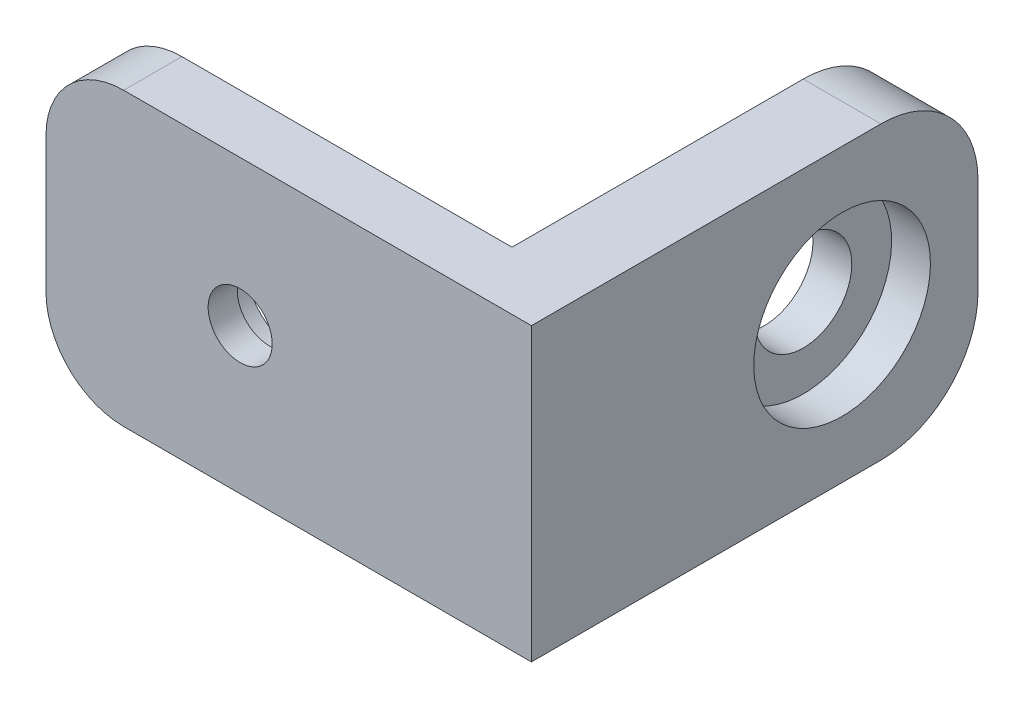
ISO-10303-21;
HEADER;
FILE_DESCRIPTION(('STEP AP214'),'2;1');
FILE_NAME('part.step','',(''),(''),'','','');
FILE_SCHEMA(('AUTOMOTIVE_DESIGN { 1 0 10303 214 1 1 1 1 }'));
ENDSEC;
DATA;
#1=APPLICATION_CONTEXT('core data for automotive mechanical design processes');
#2=APPLICATION_PROTOCOL_DEFINITION('international standard','automotive_design',2000,#1);
#3=PRODUCT_CONTEXT('',#1,'mechanical');
#4=PRODUCT('Part','Part','',(#3));
#5=PRODUCT_RELATED_PRODUCT_CATEGORY('part','',(#4));
#6=PRODUCT_DEFINITION_FORMATION('','',#4);
#7=PRODUCT_DEFINITION_CONTEXT('part definition',#1,'design');
#8=PRODUCT_DEFINITION('design','',#6,#7);
#9=PRODUCT_DEFINITION_SHAPE('','',#8);
#10=(LENGTH_UNIT() NAMED_UNIT(*) SI_UNIT(.MILLI.,.METRE.));
#11=(NAMED_UNIT(*) PLANE_ANGLE_UNIT() SI_UNIT($,.RADIAN.));
#12=(NAMED_UNIT(*) SI_UNIT($,.STERADIAN.) SOLID_ANGLE_UNIT());
#13=UNCERTAINTY_MEASURE_WITH_UNIT(LENGTH_MEASURE(1.E-05),#10,'distance_accuracy_value','');
#14=(GEOMETRIC_REPRESENTATION_CONTEXT(3) GLOBAL_UNCERTAINTY_ASSIGNED_CONTEXT((#13)) GLOBAL_UNIT_ASSIGNED_CONTEXT((#10,
#11,#12)) REPRESENTATION_CONTEXT('',''));
#15=CARTESIAN_POINT('',(0.,0.,0.));
#16=DIRECTION('',(0.,0.,1.));
#17=DIRECTION('',(1.,0.,0.));
#18=AXIS2_PLACEMENT_3D('',#15,#16,#17);
#19=CARTESIAN_POINT('',(0.,-7.5,3.));
#20=DIRECTION('',(0.,-1.,0.));
#21=DIRECTION('',(0.,0.,-1.));
#22=AXIS2_PLACEMENT_3D('',#19,#20,#21);
#23=PLANE('',#22);
#24=DIRECTION('',(-1.,0.,0.));
#25=VECTOR('',#24,1.);
#26=CARTESIAN_POINT('',(0.,-7.5,3.));
#27=LINE('',#26,#25);
#28=CARTESIAN_POINT('',(12.5,-7.5,3.));
#29=VERTEX_POINT('',#28);
#30=CARTESIAN_POINT('',(-8.5,-7.5,3.));
#31=VERTEX_POINT('',#30);
#32=EDGE_CURVE('E231',#29,#31,#27,.T.);
#33=ORIENTED_EDGE('',*,*,#32,.T.);
#34=DIRECTION('',(0.,0.,-1.));
#35=VECTOR('',#34,1.);
#36=CARTESIAN_POINT('',(-8.5,-7.5,0.));
#37=LINE('',#36,#35);
#38=CARTESIAN_POINT('',(-8.5,-7.5,0.));
#39=VERTEX_POINT('',#38);
#40=EDGE_CURVE('E10',#31,#39,#37,.T.);
#41=ORIENTED_EDGE('',*,*,#40,.T.);
#42=DIRECTION('',(-1.,0.,0.));
#43=VECTOR('',#42,1.);
#44=CARTESIAN_POINT('',(0.,-7.5,0.));
#45=LINE('',#44,#43);
#46=CARTESIAN_POINT('',(8.5,-7.5,0.));
#47=VERTEX_POINT('',#46);
#48=EDGE_CURVE('E157',#47,#39,#45,.T.);
#49=ORIENTED_EDGE('',*,*,#48,.F.);
#50=DIRECTION('',(0.,0.,1.));
#51=VECTOR('',#50,1.);
#52=CARTESIAN_POINT('',(8.5,-7.5,-20.));
#53=LINE('',#52,#51);
#54=CARTESIAN_POINT('',(8.5,-7.5,-15.));
#55=VERTEX_POINT('',#54);
#56=EDGE_CURVE('E133',#55,#47,#53,.T.);
#57=ORIENTED_EDGE('',*,*,#56,.F.);
#58=DIRECTION('',(-1.,0.,0.));
#59=VECTOR('',#58,1.);
#60=CARTESIAN_POINT('',(12.5,-7.5,-15.));
#61=LINE('',#60,#59);
#62=CARTESIAN_POINT('',(12.5,-7.5,-15.));
#63=VERTEX_POINT('',#62);
#64=EDGE_CURVE('E193',#55,#63,#61,.F.);
#65=ORIENTED_EDGE('',*,*,#64,.T.);
#66=DIRECTION('',(0.,0.,-1.));
#67=VECTOR('',#66,1.);
#68=CARTESIAN_POINT('',(12.5,-7.5,3.));
#69=LINE('',#68,#67);
#70=EDGE_CURVE('E165',#29,#63,#69,.T.);
#71=ORIENTED_EDGE('',*,*,#70,.F.);
#72=EDGE_LOOP('',(#33,#41,#49,#57,#65,#71));
#73=FACE_BOUND('',#72,.T.);
#74=ADVANCED_FACE('F16',(#73),#23,.T.);
#75=CARTESIAN_POINT('',(12.5,0.,3.));
#76=DIRECTION('',(1.,0.,0.));
#77=DIRECTION('',(0.,0.,-1.));
#78=AXIS2_PLACEMENT_3D('',#75,#76,#77);
#79=PLANE('',#78);
#80=CARTESIAN_POINT('',(12.5,0.,-13.));
#81=DIRECTION('',(1.,0.,0.));
#82=DIRECTION('',(0.,1.,0.));
#83=AXIS2_PLACEMENT_3D('',#80,#81,#82);
#84=CIRCLE('',#83,4.55);
#85=CARTESIAN_POINT('',(12.5,4.55,-13.));
#86=VERTEX_POINT('',#85);
#87=EDGE_CURVE('E294',#86,#86,#84,.T.);
#88=ORIENTED_EDGE('',*,*,#87,.F.);
#89=EDGE_LOOP('',(#88));
#90=FACE_BOUND('',#89,.T.);
#91=DIRECTION('',(0.,-1.,0.));
#92=VECTOR('',#91,1.);
#93=CARTESIAN_POINT('',(12.5,0.,-20.));
#94=LINE('',#93,#92);
#95=CARTESIAN_POINT('',(12.5,2.5,-20.));
#96=VERTEX_POINT('',#95);
#97=CARTESIAN_POINT('',(12.5,-2.5,-20.));
#98=VERTEX_POINT('',#97);
#99=EDGE_CURVE('E143',#96,#98,#94,.T.);
#100=ORIENTED_EDGE('',*,*,#99,.F.);
#101=CARTESIAN_POINT('',(12.5,2.5,-15.));
#102=DIRECTION('',(1.,0.,0.));
#103=DIRECTION('',(0.,0.,-1.));
#104=AXIS2_PLACEMENT_3D('',#101,#102,#103);
#105=CIRCLE('',#104,5.);
#106=CARTESIAN_POINT('',(12.5,7.5,-15.));
#107=VERTEX_POINT('',#106);
#108=EDGE_CURVE('E190',#96,#107,#105,.T.);
#109=ORIENTED_EDGE('',*,*,#108,.T.);
#110=DIRECTION('',(0.,0.,-1.));
#111=VECTOR('',#110,1.);
#112=CARTESIAN_POINT('',(12.5,7.5,3.));
#113=LINE('',#112,#111);
#114=CARTESIAN_POINT('',(12.5,7.5,3.));
#115=VERTEX_POINT('',#114);
#116=EDGE_CURVE('E169',#115,#107,#113,.T.);
#117=ORIENTED_EDGE('',*,*,#116,.F.);
#118=DIRECTION('',(0.,-1.,0.));
#119=VECTOR('',#118,1.);
#120=CARTESIAN_POINT('',(12.5,0.,3.));
#121=LINE('',#120,#119);
#122=EDGE_CURVE('E160',#115,#29,#121,.T.);
#123=ORIENTED_EDGE('',*,*,#122,.T.);
#124=ORIENTED_EDGE('',*,*,#70,.T.);
#125=CARTESIAN_POINT('',(12.5,-2.5,-15.));
#126=DIRECTION('',(1.,0.,0.));
#127=DIRECTION('',(0.,0.,-1.));
#128=AXIS2_PLACEMENT_3D('',#125,#126,#127);
#129=CIRCLE('',#128,5.);
#130=EDGE_CURVE('E187',#63,#98,#129,.T.);
#131=ORIENTED_EDGE('',*,*,#130,.T.);
#132=EDGE_LOOP('',(#100,#109,#117,#123,#124,#131));
#133=FACE_BOUND('',#132,.T.);
#134=ADVANCED_FACE('F248',(#90,#133),#79,.T.);
#135=CARTESIAN_POINT('',(-1.78280607962806,7.5,3.));
#136=DIRECTION('',(0.,-1.,0.));
#137=DIRECTION('',(0.,0.,-1.));
#138=AXIS2_PLACEMENT_3D('',#135,#136,#137);
#139=PLANE('',#138);
#140=DIRECTION('',(-1.,0.,0.));
#141=VECTOR('',#140,1.);
#142=CARTESIAN_POINT('',(-1.78280607962806,7.5,0.));
#143=LINE('',#142,#141);
#144=CARTESIAN_POINT('',(8.5,7.5,0.));
#145=VERTEX_POINT('',#144);
#146=CARTESIAN_POINT('',(-8.5,7.5,0.));
#147=VERTEX_POINT('',#146);
#148=EDGE_CURVE('E127',#145,#147,#143,.T.);
#149=ORIENTED_EDGE('',*,*,#148,.T.);
#150=DIRECTION('',(0.,0.,-1.));
#151=VECTOR('',#150,1.);
#152=CARTESIAN_POINT('',(-8.5,7.5,3.));
#153=LINE('',#152,#151);
#154=CARTESIAN_POINT('',(-8.5,7.5,3.));
#155=VERTEX_POINT('',#154);
#156=EDGE_CURVE('E50',#147,#155,#153,.F.);
#157=ORIENTED_EDGE('',*,*,#156,.T.);
#158=DIRECTION('',(-1.,0.,0.));
#159=VECTOR('',#158,1.);
#160=CARTESIAN_POINT('',(-1.78280607962806,7.5,3.));
#161=LINE('',#160,#159);
#162=EDGE_CURVE('E164',#115,#155,#161,.T.);
#163=ORIENTED_EDGE('',*,*,#162,.F.);
#164=ORIENTED_EDGE('',*,*,#116,.T.);
#165=DIRECTION('',(-1.,0.,0.));
#166=VECTOR('',#165,1.);
#167=CARTESIAN_POINT('',(-1.78280607962806,7.5,-15.));
#168=LINE('',#167,#166);
#169=CARTESIAN_POINT('',(8.5,7.5,-15.));
#170=VERTEX_POINT('',#169);
#171=EDGE_CURVE('E130',#107,#170,#168,.T.);
#172=ORIENTED_EDGE('',*,*,#171,.T.);
#173=DIRECTION('',(0.,0.,1.));
#174=VECTOR('',#173,1.);
#175=CARTESIAN_POINT('',(8.5,7.5,-20.));
#176=LINE('',#175,#174);
#177=EDGE_CURVE('E123',#170,#145,#176,.T.);
#178=ORIENTED_EDGE('',*,*,#177,.T.);
#179=EDGE_LOOP('',(#149,#157,#163,#164,#172,#178));
#180=FACE_BOUND('',#179,.T.);
#181=ADVANCED_FACE('F125',(#180),#139,.F.);
#182=CARTESIAN_POINT('',(-12.5,0.,3.));
#183=DIRECTION('',(1.,0.,0.));
#184=DIRECTION('',(0.,1.,0.));
#185=AXIS2_PLACEMENT_3D('',#182,#183,#184);
#186=PLANE('',#185);
#187=DIRECTION('',(0.,-1.,0.));
#188=VECTOR('',#187,1.);
#189=CARTESIAN_POINT('',(-12.5,0.,3.));
#190=LINE('',#189,#188);
#191=CARTESIAN_POINT('',(-12.5,3.5,3.));
#192=VERTEX_POINT('',#191);
#193=CARTESIAN_POINT('',(-12.5,-3.5,3.));
#194=VERTEX_POINT('',#193);
#195=EDGE_CURVE('E223',#192,#194,#190,.T.);
#196=ORIENTED_EDGE('',*,*,#195,.F.);
#197=DIRECTION('',(0.,0.,-1.));
#198=VECTOR('',#197,1.);
#199=CARTESIAN_POINT('',(-12.5,3.5,3.));
#200=LINE('',#199,#198);
#201=CARTESIAN_POINT('',(-12.5,3.5,0.));
#202=VERTEX_POINT('',#201);
#203=EDGE_CURVE('E205',#192,#202,#200,.T.);
#204=ORIENTED_EDGE('',*,*,#203,.T.);
#205=DIRECTION('',(0.,-1.,0.));
#206=VECTOR('',#205,1.);
#207=CARTESIAN_POINT('',(-12.5,0.,0.));
#208=LINE('',#207,#206);
#209=CARTESIAN_POINT('',(-12.5,-3.5,0.));
#210=VERTEX_POINT('',#209);
#211=EDGE_CURVE('E150',#202,#210,#208,.T.);
#212=ORIENTED_EDGE('',*,*,#211,.T.);
#213=DIRECTION('',(0.,0.,-1.));
#214=VECTOR('',#213,1.);
#215=CARTESIAN_POINT('',(-12.5,-3.5,3.));
#216=LINE('',#215,#214);
#217=EDGE_CURVE('E196',#210,#194,#216,.F.);
#218=ORIENTED_EDGE('',*,*,#217,.T.);
#219=EDGE_LOOP('',(#196,#204,#212,#218));
#220=FACE_BOUND('',#219,.T.);
#221=ADVANCED_FACE('F228',(#220),#186,.F.);
#222=CARTESIAN_POINT('',(0.,0.,3.));
#223=DIRECTION('',(0.,0.,1.));
#224=DIRECTION('',(1.,0.,0.));
#225=AXIS2_PLACEMENT_3D('',#222,#223,#224);
#226=PLANE('',#225);
#227=CARTESIAN_POINT('',(-2.5,0.,3.));
#228=DIRECTION('',(0.,0.,1.));
#229=DIRECTION('',(1.,0.,0.));
#230=AXIS2_PLACEMENT_3D('',#227,#228,#229);
#231=CIRCLE('',#230,1.65);
#232=CARTESIAN_POINT('',(-0.85,0.,3.));
#233=VERTEX_POINT('',#232);
#234=EDGE_CURVE('E20',#233,#233,#231,.T.);
#235=ORIENTED_EDGE('',*,*,#234,.F.);
#236=EDGE_LOOP('',(#235));
#237=FACE_BOUND('',#236,.T.);
#238=ORIENTED_EDGE('',*,*,#162,.T.);
#239=CARTESIAN_POINT('',(-8.5,3.5,3.));
#240=DIRECTION('',(0.,0.,1.));
#241=DIRECTION('',(1.,0.,0.));
#242=AXIS2_PLACEMENT_3D('',#239,#240,#241);
#243=CIRCLE('',#242,4.);
#244=EDGE_CURVE('E26',#155,#192,#243,.T.);
#245=ORIENTED_EDGE('',*,*,#244,.T.);
#246=ORIENTED_EDGE('',*,*,#195,.T.);
#247=CARTESIAN_POINT('',(-8.5,-3.5,3.));
#248=DIRECTION('',(0.,0.,1.));
#249=DIRECTION('',(1.,0.,0.));
#250=AXIS2_PLACEMENT_3D('',#247,#248,#249);
#251=CIRCLE('',#250,4.);
#252=EDGE_CURVE('E38',#194,#31,#251,.T.);
#253=ORIENTED_EDGE('',*,*,#252,.T.);
#254=ORIENTED_EDGE('',*,*,#32,.F.);
#255=ORIENTED_EDGE('',*,*,#122,.F.);
#256=EDGE_LOOP('',(#238,#245,#246,#253,#254,#255));
#257=FACE_BOUND('',#256,.T.);
#258=ADVANCED_FACE('F222',(#237,#257),#226,.T.);
#259=CARTESIAN_POINT('',(0.,0.,0.));
#260=DIRECTION('',(0.,0.,1.));
#261=DIRECTION('',(1.,0.,0.));
#262=AXIS2_PLACEMENT_3D('',#259,#260,#261);
#263=PLANE('',#262);
#264=CARTESIAN_POINT('',(-2.5,0.,0.));
#265=DIRECTION('',(0.,0.,-1.));
#266=DIRECTION('',(1.,0.,0.));
#267=AXIS2_PLACEMENT_3D('',#264,#265,#266);
#268=CIRCLE('',#267,2.75);
#269=CARTESIAN_POINT('',(0.25,0.,0.));
#270=VERTEX_POINT('',#269);
#271=EDGE_CURVE('E350',#270,#270,#268,.T.);
#272=ORIENTED_EDGE('',*,*,#271,.F.);
#273=EDGE_LOOP('',(#272));
#274=FACE_BOUND('',#273,.T.);
#275=ORIENTED_EDGE('',*,*,#211,.F.);
#276=CARTESIAN_POINT('',(-8.5,3.5,0.));
#277=DIRECTION('',(0.,0.,1.));
#278=DIRECTION('',(1.,0.,0.));
#279=AXIS2_PLACEMENT_3D('',#276,#277,#278);
#280=CIRCLE('',#279,4.);
#281=EDGE_CURVE('E148',#202,#147,#280,.F.);
#282=ORIENTED_EDGE('',*,*,#281,.T.);
#283=ORIENTED_EDGE('',*,*,#148,.F.);
#284=DIRECTION('',(0.,-1.,0.));
#285=VECTOR('',#284,1.);
#286=CARTESIAN_POINT('',(8.5,0.,0.));
#287=LINE('',#286,#285);
#288=EDGE_CURVE('E136',#145,#47,#287,.T.);
#289=ORIENTED_EDGE('',*,*,#288,.T.);
#290=ORIENTED_EDGE('',*,*,#48,.T.);
#291=CARTESIAN_POINT('',(-8.5,-3.5,0.));
#292=DIRECTION('',(0.,0.,1.));
#293=DIRECTION('',(1.,0.,0.));
#294=AXIS2_PLACEMENT_3D('',#291,#292,#293);
#295=CIRCLE('',#294,4.);
#296=EDGE_CURVE('E209',#39,#210,#295,.F.);
#297=ORIENTED_EDGE('',*,*,#296,.T.);
#298=EDGE_LOOP('',(#275,#282,#283,#289,#290,#297));
#299=FACE_BOUND('',#298,.T.);
#300=ADVANCED_FACE('F147',(#274,#299),#263,.F.);
#301=CARTESIAN_POINT('',(8.5,0.,-20.));
#302=DIRECTION('',(-1.,0.,0.));
#303=DIRECTION('',(0.,-1.,0.));
#304=AXIS2_PLACEMENT_3D('',#301,#302,#303);
#305=PLANE('',#304);
#306=CARTESIAN_POINT('',(8.5,0.,-13.));
#307=DIRECTION('',(-1.,0.,0.));
#308=DIRECTION('',(0.,-1.,0.));
#309=AXIS2_PLACEMENT_3D('',#306,#307,#308);
#310=CIRCLE('',#309,2.5);
#311=CARTESIAN_POINT('',(8.5,-2.5,-13.));
#312=VERTEX_POINT('',#311);
#313=EDGE_CURVE('E197',#312,#312,#310,.T.);
#314=ORIENTED_EDGE('',*,*,#313,.F.);
#315=EDGE_LOOP('',(#314));
#316=FACE_BOUND('',#315,.T.);
#317=ORIENTED_EDGE('',*,*,#177,.F.);
#318=CARTESIAN_POINT('',(8.5,2.5,-15.));
#319=DIRECTION('',(-1.,0.,0.));
#320=DIRECTION('',(0.,-1.,0.));
#321=AXIS2_PLACEMENT_3D('',#318,#319,#320);
#322=CIRCLE('',#321,5.);
#323=CARTESIAN_POINT('',(8.5,2.5,-20.));
#324=VERTEX_POINT('',#323);
#325=EDGE_CURVE('E177',#170,#324,#322,.T.);
#326=ORIENTED_EDGE('',*,*,#325,.T.);
#327=DIRECTION('',(0.,-1.,0.));
#328=VECTOR('',#327,1.);
#329=CARTESIAN_POINT('',(8.5,0.,-20.));
#330=LINE('',#329,#328);
#331=CARTESIAN_POINT('',(8.5,-2.5,-20.));
#332=VERTEX_POINT('',#331);
#333=EDGE_CURVE('E288',#324,#332,#330,.T.);
#334=ORIENTED_EDGE('',*,*,#333,.T.);
#335=CARTESIAN_POINT('',(8.5,-2.5,-15.));
#336=DIRECTION('',(-1.,0.,0.));
#337=DIRECTION('',(0.,-1.,0.));
#338=AXIS2_PLACEMENT_3D('',#335,#336,#337);
#339=CIRCLE('',#338,5.);
#340=EDGE_CURVE('E174',#332,#55,#339,.T.);
#341=ORIENTED_EDGE('',*,*,#340,.T.);
#342=ORIENTED_EDGE('',*,*,#56,.T.);
#343=ORIENTED_EDGE('',*,*,#288,.F.);
#344=EDGE_LOOP('',(#317,#326,#334,#341,#342,#343));
#345=FACE_BOUND('',#344,.T.);
#346=ADVANCED_FACE('F137',(#316,#345),#305,.T.);
#347=CARTESIAN_POINT('',(0.,0.,-20.));
#348=DIRECTION('',(0.,0.,1.));
#349=DIRECTION('',(1.,0.,0.));
#350=AXIS2_PLACEMENT_3D('',#347,#348,#349);
#351=PLANE('',#350);
#352=ORIENTED_EDGE('',*,*,#333,.F.);
#353=DIRECTION('',(-1.,0.,0.));
#354=VECTOR('',#353,1.);
#355=CARTESIAN_POINT('',(0.,2.5,-20.));
#356=LINE('',#355,#354);
#357=EDGE_CURVE('E184',#324,#96,#356,.F.);
#358=ORIENTED_EDGE('',*,*,#357,.T.);
#359=ORIENTED_EDGE('',*,*,#99,.T.);
#360=DIRECTION('',(-1.,0.,0.));
#361=VECTOR('',#360,1.);
#362=CARTESIAN_POINT('',(8.5,-2.5,-20.));
#363=LINE('',#362,#361);
#364=EDGE_CURVE('E180',#98,#332,#363,.T.);
#365=ORIENTED_EDGE('',*,*,#364,.T.);
#366=EDGE_LOOP('',(#352,#358,#359,#365));
#367=FACE_BOUND('',#366,.T.);
#368=ADVANCED_FACE('F265',(#367),#351,.F.);
#369=CARTESIAN_POINT('',(-1.78280607962806,2.5,-15.));
#370=DIRECTION('',(-1.,0.,0.));
#371=DIRECTION('',(0.,0.,1.));
#372=AXIS2_PLACEMENT_3D('',#369,#370,#371);
#373=CYLINDRICAL_SURFACE('',#372,5.);
#374=ORIENTED_EDGE('',*,*,#108,.F.);
#375=ORIENTED_EDGE('',*,*,#357,.F.);
#376=ORIENTED_EDGE('',*,*,#325,.F.);
#377=ORIENTED_EDGE('',*,*,#171,.F.);
#378=EDGE_LOOP('',(#374,#375,#376,#377));
#379=FACE_BOUND('',#378,.T.);
#380=ADVANCED_FACE('F262',(#379),#373,.T.);
#381=CARTESIAN_POINT('',(0.,-2.5,-15.));
#382=DIRECTION('',(1.,0.,0.));
#383=DIRECTION('',(0.,0.,-1.));
#384=AXIS2_PLACEMENT_3D('',#381,#382,#383);
#385=CYLINDRICAL_SURFACE('',#384,5.);
#386=ORIENTED_EDGE('',*,*,#130,.F.);
#387=ORIENTED_EDGE('',*,*,#64,.F.);
#388=ORIENTED_EDGE('',*,*,#340,.F.);
#389=ORIENTED_EDGE('',*,*,#364,.F.);
#390=EDGE_LOOP('',(#386,#387,#388,#389));
#391=FACE_BOUND('',#390,.T.);
#392=ADVANCED_FACE('F264',(#391),#385,.T.);
#393=CARTESIAN_POINT('',(10.5,0.,-13.));
#394=DIRECTION('',(1.,0.,0.));
#395=DIRECTION('',(0.,0.,-1.));
#396=AXIS2_PLACEMENT_3D('',#393,#394,#395);
#397=CYLINDRICAL_SURFACE('',#396,4.55);
#398=CARTESIAN_POINT('',(10.5,0.,-13.));
#399=DIRECTION('',(1.,0.,0.));
#400=DIRECTION('',(0.,1.,0.));
#401=AXIS2_PLACEMENT_3D('',#398,#399,#400);
#402=CIRCLE('',#401,4.55);
#403=CARTESIAN_POINT('',(10.5,4.55,-13.));
#404=VERTEX_POINT('',#403);
#405=EDGE_CURVE('E144',#404,#404,#402,.T.);
#406=ORIENTED_EDGE('',*,*,#405,.F.);
#407=EDGE_LOOP('',(#406));
#408=FACE_BOUND('',#407,.T.);
#409=ORIENTED_EDGE('',*,*,#87,.T.);
#410=EDGE_LOOP('',(#409));
#411=FACE_BOUND('',#410,.T.);
#412=ADVANCED_FACE('F268',(#408,#411),#397,.F.);
#413=CARTESIAN_POINT('',(10.5,0.,-8.5));
#414=DIRECTION('',(1.,0.,0.));
#415=DIRECTION('',(0.,1.,0.));
#416=AXIS2_PLACEMENT_3D('',#413,#414,#415);
#417=PLANE('',#416);
#418=CARTESIAN_POINT('',(10.5,0.,-13.));
#419=DIRECTION('',(1.,0.,0.));
#420=DIRECTION('',(0.,1.,0.));
#421=AXIS2_PLACEMENT_3D('',#418,#419,#420);
#422=CIRCLE('',#421,2.5);
#423=CARTESIAN_POINT('',(10.5,2.5,-13.));
#424=VERTEX_POINT('',#423);
#425=EDGE_CURVE('E201',#424,#424,#422,.T.);
#426=ORIENTED_EDGE('',*,*,#425,.F.);
#427=EDGE_LOOP('',(#426));
#428=FACE_BOUND('',#427,.T.);
#429=ORIENTED_EDGE('',*,*,#405,.T.);
#430=EDGE_LOOP('',(#429));
#431=FACE_BOUND('',#430,.T.);
#432=ADVANCED_FACE('F243',(#428,#431),#417,.T.);
#433=CARTESIAN_POINT('',(-12.5,0.,-13.));
#434=DIRECTION('',(1.,0.,0.));
#435=DIRECTION('',(0.,0.,-1.));
#436=AXIS2_PLACEMENT_3D('',#433,#434,#435);
#437=CYLINDRICAL_SURFACE('',#436,2.5);
#438=ORIENTED_EDGE('',*,*,#425,.T.);
#439=EDGE_LOOP('',(#438));
#440=FACE_BOUND('',#439,.T.);
#441=ORIENTED_EDGE('',*,*,#313,.T.);
#442=EDGE_LOOP('',(#441));
#443=FACE_BOUND('',#442,.T.);
#444=ADVANCED_FACE('F235',(#440,#443),#437,.F.);
#445=CARTESIAN_POINT('',(-8.5,3.5,3.));
#446=DIRECTION('',(0.,0.,-1.));
#447=DIRECTION('',(-1.,0.,0.));
#448=AXIS2_PLACEMENT_3D('',#445,#446,#447);
#449=CYLINDRICAL_SURFACE('',#448,4.);
#450=ORIENTED_EDGE('',*,*,#244,.F.);
#451=ORIENTED_EDGE('',*,*,#156,.F.);
#452=ORIENTED_EDGE('',*,*,#281,.F.);
#453=ORIENTED_EDGE('',*,*,#203,.F.);
#454=EDGE_LOOP('',(#450,#451,#452,#453));
#455=FACE_BOUND('',#454,.T.);
#456=ADVANCED_FACE('F233',(#455),#449,.T.);
#457=CARTESIAN_POINT('',(-8.5,-3.5,3.));
#458=DIRECTION('',(0.,0.,1.));
#459=DIRECTION('',(1.,0.,0.));
#460=AXIS2_PLACEMENT_3D('',#457,#458,#459);
#461=CYLINDRICAL_SURFACE('',#460,4.);
#462=ORIENTED_EDGE('',*,*,#252,.F.);
#463=ORIENTED_EDGE('',*,*,#217,.F.);
#464=ORIENTED_EDGE('',*,*,#296,.F.);
#465=ORIENTED_EDGE('',*,*,#40,.F.);
#466=EDGE_LOOP('',(#462,#463,#464,#465));
#467=FACE_BOUND('',#466,.T.);
#468=ADVANCED_FACE('F18',(#467),#461,.T.);
#469=CARTESIAN_POINT('',(-2.5,0.,1.5));
#470=DIRECTION('',(0.,0.,-1.));
#471=DIRECTION('',(-1.,0.,0.));
#472=AXIS2_PLACEMENT_3D('',#469,#470,#471);
#473=CYLINDRICAL_SURFACE('',#472,2.75);
#474=CARTESIAN_POINT('',(-2.5,0.,1.5));
#475=DIRECTION('',(0.,0.,-1.));
#476=DIRECTION('',(1.,0.,0.));
#477=AXIS2_PLACEMENT_3D('',#474,#475,#476);
#478=CIRCLE('',#477,2.75);
#479=CARTESIAN_POINT('',(0.25,0.,1.5));
#480=VERTEX_POINT('',#479);
#481=EDGE_CURVE('E202',#480,#480,#478,.T.);
#482=ORIENTED_EDGE('',*,*,#481,.F.);
#483=EDGE_LOOP('',(#482));
#484=FACE_BOUND('',#483,.T.);
#485=ORIENTED_EDGE('',*,*,#271,.T.);
#486=EDGE_LOOP('',(#485));
#487=FACE_BOUND('',#486,.T.);
#488=ADVANCED_FACE('F241',(#484,#487),#473,.F.);
#489=CARTESIAN_POINT('',(-2.,0.,1.5));
#490=DIRECTION('',(0.,0.,-1.));
#491=DIRECTION('',(1.,0.,0.));
#492=AXIS2_PLACEMENT_3D('',#489,#490,#491);
#493=PLANE('',#492);
#494=CARTESIAN_POINT('',(-2.5,0.,1.5));
#495=DIRECTION('',(0.,0.,-1.));
#496=DIRECTION('',(1.,0.,0.));
#497=AXIS2_PLACEMENT_3D('',#494,#495,#496);
#498=CIRCLE('',#497,1.65);
#499=CARTESIAN_POINT('',(-0.85,0.,1.5));
#500=VERTEX_POINT('',#499);
#501=EDGE_CURVE('E354',#500,#500,#498,.T.);
#502=ORIENTED_EDGE('',*,*,#501,.F.);
#503=EDGE_LOOP('',(#502));
#504=FACE_BOUND('',#503,.T.);
#505=ORIENTED_EDGE('',*,*,#481,.T.);
#506=EDGE_LOOP('',(#505));
#507=FACE_BOUND('',#506,.T.);
#508=ADVANCED_FACE('F389',(#504,#507),#493,.T.);
#509=CARTESIAN_POINT('',(-2.5,0.,37.1448892552543));
#510=DIRECTION('',(0.,0.,-1.));
#511=DIRECTION('',(-1.,0.,0.));
#512=AXIS2_PLACEMENT_3D('',#509,#510,#511);
#513=CYLINDRICAL_SURFACE('',#512,1.65);
#514=ORIENTED_EDGE('',*,*,#501,.T.);
#515=EDGE_LOOP('',(#514));
#516=FACE_BOUND('',#515,.T.);
#517=ORIENTED_EDGE('',*,*,#234,.T.);
#518=EDGE_LOOP('',(#517));
#519=FACE_BOUND('',#518,.T.);
#520=ADVANCED_FACE('F370',(#516,#519),#513,.F.);
#521=CLOSED_SHELL('',(#74,#134,#181,#221,#258,#300,#346,#368,#380,#392,#412,#432,#444,#456,#468,
#488,#508,#520));
#522=MANIFOLD_SOLID_BREP('B1',#521);
#523=ADVANCED_BREP_SHAPE_REPRESENTATION('',(#18,#522),#14);
#524=SHAPE_DEFINITION_REPRESENTATION(#9,#523);
ENDSEC;
END-ISO-10303-21;
